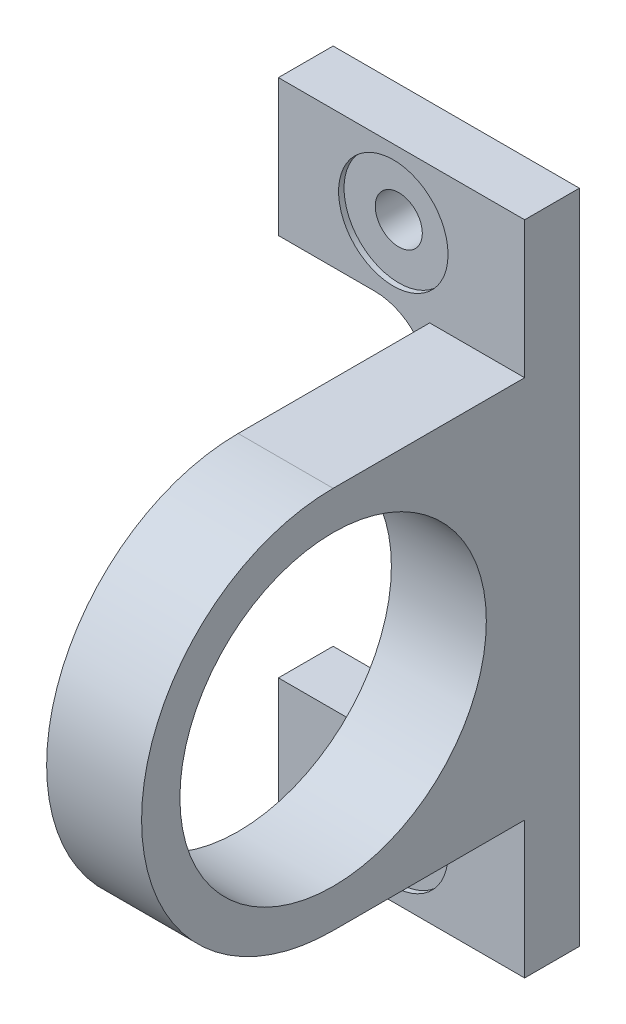
ISO-10303-21;
HEADER;
FILE_DESCRIPTION(('STEP AP214'),'2;1');
FILE_NAME('part.step','',(''),(''),'','','');
FILE_SCHEMA(('AUTOMOTIVE_DESIGN { 1 0 10303 214 1 1 1 1 }'));
ENDSEC;
DATA;
#1=APPLICATION_CONTEXT('core data for automotive mechanical design processes');
#2=APPLICATION_PROTOCOL_DEFINITION('international standard','automotive_design',2000,#1);
#3=PRODUCT_CONTEXT('',#1,'mechanical');
#4=PRODUCT('Part','Part','',(#3));
#5=PRODUCT_RELATED_PRODUCT_CATEGORY('part','',(#4));
#6=PRODUCT_DEFINITION_FORMATION('','',#4);
#7=PRODUCT_DEFINITION_CONTEXT('part definition',#1,'design');
#8=PRODUCT_DEFINITION('design','',#6,#7);
#9=PRODUCT_DEFINITION_SHAPE('','',#8);
#10=(LENGTH_UNIT() NAMED_UNIT(*) SI_UNIT(.MILLI.,.METRE.));
#11=(NAMED_UNIT(*) PLANE_ANGLE_UNIT() SI_UNIT($,.RADIAN.));
#12=(NAMED_UNIT(*) SI_UNIT($,.STERADIAN.) SOLID_ANGLE_UNIT());
#13=UNCERTAINTY_MEASURE_WITH_UNIT(LENGTH_MEASURE(1.E-05),#10,'distance_accuracy_value','');
#14=(GEOMETRIC_REPRESENTATION_CONTEXT(3) GLOBAL_UNCERTAINTY_ASSIGNED_CONTEXT((#13)) GLOBAL_UNIT_ASSIGNED_CONTEXT((#10,
#11,#12)) REPRESENTATION_CONTEXT('',''));
#15=CARTESIAN_POINT('',(0.,0.,0.));
#16=DIRECTION('',(0.,0.,1.));
#17=DIRECTION('',(1.,0.,0.));
#18=AXIS2_PLACEMENT_3D('',#15,#16,#17);
#19=CARTESIAN_POINT('',(7.72642356527553,24.3382352941177,-0.00999999999999959));
#20=DIRECTION('',(-1.,0.,0.));
#21=DIRECTION('',(0.,-1.,0.));
#22=AXIS2_PLACEMENT_3D('',#19,#20,#21);
#23=PLANE('',#22);
#24=DIRECTION('',(0.,-1.,0.));
#25=VECTOR('',#24,1.);
#26=CARTESIAN_POINT('',(7.72642356527553,0.,5.));
#27=LINE('',#26,#25);
#28=CARTESIAN_POINT('',(7.72642356527553,24.3382352941177,5.));
#29=VERTEX_POINT('',#28);
#30=CARTESIAN_POINT('',(7.72642356527553,11.8382352941177,5.));
#31=VERTEX_POINT('',#30);
#32=EDGE_CURVE('E227',#29,#31,#27,.T.);
#33=ORIENTED_EDGE('',*,*,#32,.F.);
#34=DIRECTION('',(0.,0.,-1.));
#35=VECTOR('',#34,1.);
#36=CARTESIAN_POINT('',(7.72642356527553,24.3382352941177,5.));
#37=LINE('',#36,#35);
#38=CARTESIAN_POINT('',(7.72642356527552,24.3382352941177,0.));
#39=VERTEX_POINT('',#38);
#40=EDGE_CURVE('E180',#29,#39,#37,.T.);
#41=ORIENTED_EDGE('',*,*,#40,.T.);
#42=DIRECTION('',(0.,-1.,0.));
#43=VECTOR('',#42,1.);
#44=CARTESIAN_POINT('',(7.72642356527553,0.,0.));
#45=LINE('',#44,#43);
#46=CARTESIAN_POINT('',(7.72642356527552,11.8382352941177,0.));
#47=VERTEX_POINT('',#46);
#48=EDGE_CURVE('E181',#39,#47,#45,.T.);
#49=ORIENTED_EDGE('',*,*,#48,.T.);
#50=DIRECTION('',(0.,0.,1.));
#51=VECTOR('',#50,1.);
#52=CARTESIAN_POINT('',(7.72642356527553,11.8382352941177,5.));
#53=LINE('',#52,#51);
#54=EDGE_CURVE('E230',#47,#31,#53,.T.);
#55=ORIENTED_EDGE('',*,*,#54,.T.);
#56=EDGE_LOOP('',(#33,#41,#49,#55));
#57=FACE_BOUND('',#56,.T.);
#58=ADVANCED_FACE('F54',(#57),#23,.T.);
#59=DIRECTION('',(0.,-1.,0.));
#60=VECTOR('',#59,1.);
#61=CARTESIAN_POINT('',(7.72642356527553,0.,5.));
#62=LINE('',#61,#60);
#63=CARTESIAN_POINT('',(7.72642356527552,-23.1617647058823,5.));
#64=VERTEX_POINT('',#63);
#65=CARTESIAN_POINT('',(7.72642356527552,-35.6617647058823,5.));
#66=VERTEX_POINT('',#65);
#67=EDGE_CURVE('E224',#64,#66,#62,.T.);
#68=ORIENTED_EDGE('',*,*,#67,.F.);
#69=DIRECTION('',(0.,0.,-1.));
#70=VECTOR('',#69,1.);
#71=CARTESIAN_POINT('',(7.72642356527552,-23.1617647058823,5.));
#72=LINE('',#71,#70);
#73=CARTESIAN_POINT('',(7.72642356527552,-23.1617647058823,0.));
#74=VERTEX_POINT('',#73);
#75=EDGE_CURVE('E186',#64,#74,#72,.T.);
#76=ORIENTED_EDGE('',*,*,#75,.T.);
#77=CARTESIAN_POINT('',(7.72642356527552,-35.6617647058823,0.));
#78=VERTEX_POINT('',#77);
#79=EDGE_CURVE('E163',#74,#78,#45,.T.);
#80=ORIENTED_EDGE('',*,*,#79,.T.);
#81=DIRECTION('',(0.,0.,1.));
#82=VECTOR('',#81,1.);
#83=CARTESIAN_POINT('',(7.72642356527552,-35.6617647058823,5.));
#84=LINE('',#83,#82);
#85=EDGE_CURVE('E174',#78,#66,#84,.T.);
#86=ORIENTED_EDGE('',*,*,#85,.T.);
#87=EDGE_LOOP('',(#68,#76,#80,#86));
#88=FACE_BOUND('',#87,.T.);
#89=ADVANCED_FACE('F184',(#88),#23,.T.);
#90=CARTESIAN_POINT('',(0.,0.,5.));
#91=DIRECTION('',(0.,0.,1.));
#92=DIRECTION('',(1.,0.,0.));
#93=AXIS2_PLACEMENT_3D('',#90,#91,#92);
#94=PLANE('',#93);
#95=CARTESIAN_POINT('',(18.2264235652755,18.0882352941177,5.));
#96=DIRECTION('',(0.,0.,1.));
#97=DIRECTION('',(1.,0.,0.));
#98=AXIS2_PLACEMENT_3D('',#95,#96,#97);
#99=CIRCLE('',#98,4.99999999999999);
#100=CARTESIAN_POINT('',(23.2264235652755,18.0882352941177,5.));
#101=VERTEX_POINT('',#100);
#102=EDGE_CURVE('E458',#101,#101,#99,.T.);
#103=ORIENTED_EDGE('',*,*,#102,.F.);
#104=EDGE_LOOP('',(#103));
#105=FACE_BOUND('',#104,.T.);
#106=DIRECTION('',(-1.,0.,0.));
#107=VECTOR('',#106,1.);
#108=CARTESIAN_POINT('',(0.,24.3382352941177,5.));
#109=LINE('',#108,#107);
#110=CARTESIAN_POINT('',(30.2264235652755,24.3382352941177,5.));
#111=VERTEX_POINT('',#110);
#112=EDGE_CURVE('E201',#111,#29,#109,.T.);
#113=ORIENTED_EDGE('',*,*,#112,.T.);
#114=ORIENTED_EDGE('',*,*,#32,.T.);
#115=DIRECTION('',(1.,0.,0.));
#116=VECTOR('',#115,1.);
#117=CARTESIAN_POINT('',(0.,11.8382352941177,5.));
#118=LINE('',#117,#116);
#119=CARTESIAN_POINT('',(16.5499529770402,11.8382352941177,5.));
#120=VERTEX_POINT('',#119);
#121=EDGE_CURVE('E197',#31,#120,#118,.T.);
#122=ORIENTED_EDGE('',*,*,#121,.T.);
#123=CARTESIAN_POINT('',(16.5499529770402,6.83823529411772,5.));
#124=DIRECTION('',(0.,0.,1.));
#125=DIRECTION('',(1.,0.,0.));
#126=AXIS2_PLACEMENT_3D('',#123,#124,#125);
#127=CIRCLE('',#126,5.);
#128=CARTESIAN_POINT('',(21.5499529770402,6.83823529411772,5.));
#129=VERTEX_POINT('',#128);
#130=EDGE_CURVE('E287',#120,#129,#127,.F.);
#131=ORIENTED_EDGE('',*,*,#130,.T.);
#132=DIRECTION('',(0.,-1.,0.));
#133=VECTOR('',#132,1.);
#134=CARTESIAN_POINT('',(21.5499529770402,0.,5.));
#135=LINE('',#134,#133);
#136=CARTESIAN_POINT('',(21.5499529770402,11.8382352941177,5.));
#137=VERTEX_POINT('',#136);
#138=EDGE_CURVE('E286',#137,#129,#135,.T.);
#139=ORIENTED_EDGE('',*,*,#138,.F.);
#140=DIRECTION('',(-1.,0.,0.));
#141=VECTOR('',#140,1.);
#142=CARTESIAN_POINT('',(30.2264235652755,11.8382352941177,5.));
#143=LINE('',#142,#141);
#144=CARTESIAN_POINT('',(30.2264235652755,11.8382352941177,5.));
#145=VERTEX_POINT('',#144);
#146=EDGE_CURVE('E215',#145,#137,#143,.T.);
#147=ORIENTED_EDGE('',*,*,#146,.F.);
#148=DIRECTION('',(0.,-1.,0.));
#149=VECTOR('',#148,1.);
#150=CARTESIAN_POINT('',(30.2264235652755,0.,5.));
#151=LINE('',#150,#149);
#152=EDGE_CURVE('E203',#111,#145,#151,.T.);
#153=ORIENTED_EDGE('',*,*,#152,.F.);
#154=EDGE_LOOP('',(#113,#114,#122,#131,#139,#147,#153));
#155=FACE_BOUND('',#154,.T.);
#156=ADVANCED_FACE('F250',(#105,#155),#94,.T.);
#157=CARTESIAN_POINT('',(18.2264235652755,-29.4117647058823,5.));
#158=DIRECTION('',(0.,0.,1.));
#159=DIRECTION('',(1.,0.,0.));
#160=AXIS2_PLACEMENT_3D('',#157,#158,#159);
#161=CIRCLE('',#160,4.99999999999999);
#162=CARTESIAN_POINT('',(23.2264235652755,-29.4117647058823,5.));
#163=VERTEX_POINT('',#162);
#164=EDGE_CURVE('E446',#163,#163,#161,.T.);
#165=ORIENTED_EDGE('',*,*,#164,.F.);
#166=EDGE_LOOP('',(#165));
#167=FACE_BOUND('',#166,.T.);
#168=DIRECTION('',(-1.,0.,0.));
#169=VECTOR('',#168,1.);
#170=CARTESIAN_POINT('',(0.,-23.1617647058823,5.));
#171=LINE('',#170,#169);
#172=CARTESIAN_POINT('',(16.5499529770402,-23.1617647058823,5.));
#173=VERTEX_POINT('',#172);
#174=EDGE_CURVE('E195',#173,#64,#171,.T.);
#175=ORIENTED_EDGE('',*,*,#174,.T.);
#176=ORIENTED_EDGE('',*,*,#67,.T.);
#177=DIRECTION('',(1.,0.,0.));
#178=VECTOR('',#177,1.);
#179=CARTESIAN_POINT('',(0.,-35.6617647058823,5.));
#180=LINE('',#179,#178);
#181=CARTESIAN_POINT('',(30.2264235652755,-35.6617647058823,5.));
#182=VERTEX_POINT('',#181);
#183=EDGE_CURVE('E176',#66,#182,#180,.T.);
#184=ORIENTED_EDGE('',*,*,#183,.T.);
#185=CARTESIAN_POINT('',(30.2264235652755,-23.1617647058823,5.));
#186=VERTEX_POINT('',#185);
#187=EDGE_CURVE('E207',#186,#182,#151,.T.);
#188=ORIENTED_EDGE('',*,*,#187,.F.);
#189=DIRECTION('',(1.,0.,0.));
#190=VECTOR('',#189,1.);
#191=CARTESIAN_POINT('',(30.2264235652755,-23.1617647058823,5.));
#192=LINE('',#191,#190);
#193=CARTESIAN_POINT('',(21.5499529770402,-23.1617647058823,5.));
#194=VERTEX_POINT('',#193);
#195=EDGE_CURVE('E218',#194,#186,#192,.T.);
#196=ORIENTED_EDGE('',*,*,#195,.F.);
#197=DIRECTION('',(0.,-1.,0.));
#198=VECTOR('',#197,1.);
#199=CARTESIAN_POINT('',(21.5499529770402,0.,5.));
#200=LINE('',#199,#198);
#201=CARTESIAN_POINT('',(21.5499529770402,-18.1617647058823,5.));
#202=VERTEX_POINT('',#201);
#203=EDGE_CURVE('E259',#202,#194,#200,.T.);
#204=ORIENTED_EDGE('',*,*,#203,.F.);
#205=CARTESIAN_POINT('',(16.5499529770402,-18.1617647058823,5.));
#206=DIRECTION('',(0.,0.,1.));
#207=DIRECTION('',(1.,0.,0.));
#208=AXIS2_PLACEMENT_3D('',#205,#206,#207);
#209=CIRCLE('',#208,5.);
#210=EDGE_CURVE('E226',#202,#173,#209,.F.);
#211=ORIENTED_EDGE('',*,*,#210,.T.);
#212=EDGE_LOOP('',(#175,#176,#184,#188,#196,#204,#211));
#213=FACE_BOUND('',#212,.T.);
#214=ADVANCED_FACE('F279',(#167,#213),#94,.T.);
#215=CARTESIAN_POINT('',(0.,11.8382352941177,5.));
#216=DIRECTION('',(0.,1.,0.));
#217=DIRECTION('',(-1.,0.,0.));
#218=AXIS2_PLACEMENT_3D('',#215,#216,#217);
#219=PLANE('',#218);
#220=ORIENTED_EDGE('',*,*,#54,.F.);
#221=DIRECTION('',(1.,0.,0.));
#222=VECTOR('',#221,1.);
#223=CARTESIAN_POINT('',(0.,11.8382352941177,0.));
#224=LINE('',#223,#222);
#225=CARTESIAN_POINT('',(16.5499529770402,11.8382352941177,0.));
#226=VERTEX_POINT('',#225);
#227=EDGE_CURVE('E171',#47,#226,#224,.T.);
#228=ORIENTED_EDGE('',*,*,#227,.T.);
#229=DIRECTION('',(0.,0.,-1.));
#230=VECTOR('',#229,1.);
#231=CARTESIAN_POINT('',(16.5499529770402,11.8382352941177,5.));
#232=LINE('',#231,#230);
#233=EDGE_CURVE('E247',#226,#120,#232,.F.);
#234=ORIENTED_EDGE('',*,*,#233,.T.);
#235=ORIENTED_EDGE('',*,*,#121,.F.);
#236=EDGE_LOOP('',(#220,#228,#234,#235));
#237=FACE_BOUND('',#236,.T.);
#238=ADVANCED_FACE('F246',(#237),#219,.F.);
#239=CARTESIAN_POINT('',(0.,-23.1617647058823,5.));
#240=DIRECTION('',(0.,-1.,0.));
#241=DIRECTION('',(1.,0.,0.));
#242=AXIS2_PLACEMENT_3D('',#239,#240,#241);
#243=PLANE('',#242);
#244=ORIENTED_EDGE('',*,*,#75,.F.);
#245=ORIENTED_EDGE('',*,*,#174,.F.);
#246=DIRECTION('',(0.,0.,-1.));
#247=VECTOR('',#246,1.);
#248=CARTESIAN_POINT('',(16.5499529770402,-23.1617647058823,5.));
#249=LINE('',#248,#247);
#250=CARTESIAN_POINT('',(16.5499529770402,-23.1617647058823,0.));
#251=VERTEX_POINT('',#250);
#252=EDGE_CURVE('E426',#173,#251,#249,.T.);
#253=ORIENTED_EDGE('',*,*,#252,.T.);
#254=DIRECTION('',(-1.,0.,0.));
#255=VECTOR('',#254,1.);
#256=CARTESIAN_POINT('',(0.,-23.1617647058823,0.));
#257=LINE('',#256,#255);
#258=EDGE_CURVE('E204',#251,#74,#257,.T.);
#259=ORIENTED_EDGE('',*,*,#258,.T.);
#260=EDGE_LOOP('',(#244,#245,#253,#259));
#261=FACE_BOUND('',#260,.T.);
#262=ADVANCED_FACE('F323',(#261),#243,.F.);
#263=CARTESIAN_POINT('',(0.,24.3382352941177,5.));
#264=DIRECTION('',(0.,-1.,0.));
#265=DIRECTION('',(0.,0.,-1.));
#266=AXIS2_PLACEMENT_3D('',#263,#264,#265);
#267=PLANE('',#266);
#268=ORIENTED_EDGE('',*,*,#40,.F.);
#269=ORIENTED_EDGE('',*,*,#112,.F.);
#270=DIRECTION('',(0.,0.,-1.));
#271=VECTOR('',#270,1.);
#272=CARTESIAN_POINT('',(30.2264235652755,24.3382352941177,5.));
#273=LINE('',#272,#271);
#274=CARTESIAN_POINT('',(30.2264235652755,24.3382352941177,0.));
#275=VERTEX_POINT('',#274);
#276=EDGE_CURVE('E255',#111,#275,#273,.T.);
#277=ORIENTED_EDGE('',*,*,#276,.T.);
#278=DIRECTION('',(-1.,0.,0.));
#279=VECTOR('',#278,1.);
#280=CARTESIAN_POINT('',(0.,24.3382352941177,0.));
#281=LINE('',#280,#279);
#282=EDGE_CURVE('E170',#275,#39,#281,.T.);
#283=ORIENTED_EDGE('',*,*,#282,.T.);
#284=EDGE_LOOP('',(#268,#269,#277,#283));
#285=FACE_BOUND('',#284,.T.);
#286=ADVANCED_FACE('F254',(#285),#267,.F.);
#287=CARTESIAN_POINT('',(0.,-35.6617647058823,5.));
#288=DIRECTION('',(0.,1.,0.));
#289=DIRECTION('',(0.,0.,1.));
#290=AXIS2_PLACEMENT_3D('',#287,#288,#289);
#291=PLANE('',#290);
#292=ORIENTED_EDGE('',*,*,#85,.F.);
#293=DIRECTION('',(1.,0.,0.));
#294=VECTOR('',#293,1.);
#295=CARTESIAN_POINT('',(0.,-35.6617647058823,0.));
#296=LINE('',#295,#294);
#297=CARTESIAN_POINT('',(30.2264235652755,-35.6617647058823,0.));
#298=VERTEX_POINT('',#297);
#299=EDGE_CURVE('E158',#78,#298,#296,.T.);
#300=ORIENTED_EDGE('',*,*,#299,.T.);
#301=DIRECTION('',(0.,0.,-1.));
#302=VECTOR('',#301,1.);
#303=CARTESIAN_POINT('',(30.2264235652755,-35.6617647058823,5.));
#304=LINE('',#303,#302);
#305=EDGE_CURVE('E198',#182,#298,#304,.T.);
#306=ORIENTED_EDGE('',*,*,#305,.F.);
#307=ORIENTED_EDGE('',*,*,#183,.F.);
#308=EDGE_LOOP('',(#292,#300,#306,#307));
#309=FACE_BOUND('',#308,.T.);
#310=ADVANCED_FACE('F175',(#309),#291,.F.);
#311=CARTESIAN_POINT('',(0.,0.,0.));
#312=DIRECTION('',(0.,0.,1.));
#313=DIRECTION('',(1.,0.,0.));
#314=AXIS2_PLACEMENT_3D('',#311,#312,#313);
#315=PLANE('',#314);
#316=CARTESIAN_POINT('',(18.2264235652755,18.0882352941177,0.));
#317=DIRECTION('',(0.,0.,1.));
#318=DIRECTION('',(1.,0.,0.));
#319=AXIS2_PLACEMENT_3D('',#316,#317,#318);
#320=CIRCLE('',#319,2.15);
#321=CARTESIAN_POINT('',(20.3764235652755,18.0882352941177,0.));
#322=VERTEX_POINT('',#321);
#323=EDGE_CURVE('E449',#322,#322,#320,.T.);
#324=ORIENTED_EDGE('',*,*,#323,.T.);
#325=EDGE_LOOP('',(#324));
#326=FACE_BOUND('',#325,.T.);
#327=CARTESIAN_POINT('',(18.2264235652755,-29.4117647058823,0.));
#328=DIRECTION('',(0.,0.,1.));
#329=DIRECTION('',(1.,0.,0.));
#330=AXIS2_PLACEMENT_3D('',#327,#328,#329);
#331=CIRCLE('',#330,2.15);
#332=CARTESIAN_POINT('',(20.3764235652755,-29.4117647058823,0.));
#333=VERTEX_POINT('',#332);
#334=EDGE_CURVE('E187',#333,#333,#331,.T.);
#335=ORIENTED_EDGE('',*,*,#334,.T.);
#336=EDGE_LOOP('',(#335));
#337=FACE_BOUND('',#336,.T.);
#338=ORIENTED_EDGE('',*,*,#48,.F.);
#339=ORIENTED_EDGE('',*,*,#282,.F.);
#340=DIRECTION('',(0.,-1.,0.));
#341=VECTOR('',#340,1.);
#342=CARTESIAN_POINT('',(30.2264235652755,0.,0.));
#343=LINE('',#342,#341);
#344=EDGE_CURVE('E166',#275,#298,#343,.T.);
#345=ORIENTED_EDGE('',*,*,#344,.T.);
#346=ORIENTED_EDGE('',*,*,#299,.F.);
#347=ORIENTED_EDGE('',*,*,#79,.F.);
#348=ORIENTED_EDGE('',*,*,#258,.F.);
#349=CARTESIAN_POINT('',(16.5499529770402,-18.1617647058823,0.));
#350=DIRECTION('',(0.,0.,1.));
#351=DIRECTION('',(1.,0.,0.));
#352=AXIS2_PLACEMENT_3D('',#349,#350,#351);
#353=CIRCLE('',#352,5.);
#354=CARTESIAN_POINT('',(21.5499529770402,-18.1617647058823,0.));
#355=VERTEX_POINT('',#354);
#356=EDGE_CURVE('E424',#251,#355,#353,.T.);
#357=ORIENTED_EDGE('',*,*,#356,.T.);
#358=DIRECTION('',(0.,1.,0.));
#359=VECTOR('',#358,1.);
#360=CARTESIAN_POINT('',(21.5499529770402,0.,0.));
#361=LINE('',#360,#359);
#362=CARTESIAN_POINT('',(21.5499529770402,6.83823529411772,0.));
#363=VERTEX_POINT('',#362);
#364=EDGE_CURVE('E206',#355,#363,#361,.T.);
#365=ORIENTED_EDGE('',*,*,#364,.T.);
#366=CARTESIAN_POINT('',(16.5499529770402,6.83823529411772,0.));
#367=DIRECTION('',(0.,0.,1.));
#368=DIRECTION('',(1.,0.,0.));
#369=AXIS2_PLACEMENT_3D('',#366,#367,#368);
#370=CIRCLE('',#369,5.);
#371=EDGE_CURVE('E242',#363,#226,#370,.T.);
#372=ORIENTED_EDGE('',*,*,#371,.T.);
#373=ORIENTED_EDGE('',*,*,#227,.F.);
#374=EDGE_LOOP('',(#338,#339,#345,#346,#347,#348,#357,#365,#372,#373));
#375=FACE_BOUND('',#374,.T.);
#376=ADVANCED_FACE('F56',(#326,#337,#375),#315,.F.);
#377=CARTESIAN_POINT('',(21.5499529770402,0.,5.));
#378=DIRECTION('',(-1.,0.,0.));
#379=DIRECTION('',(0.,0.,1.));
#380=AXIS2_PLACEMENT_3D('',#377,#378,#379);
#381=PLANE('',#380);
#382=CARTESIAN_POINT('',(21.5499529770402,-5.66176470588227,22.5));
#383=DIRECTION('',(-1.,0.,0.));
#384=DIRECTION('',(0.,0.,1.));
#385=AXIS2_PLACEMENT_3D('',#382,#383,#384);
#386=CIRCLE('',#385,14.);
#387=CARTESIAN_POINT('',(21.5499529770402,-5.66176470588227,36.5));
#388=VERTEX_POINT('',#387);
#389=EDGE_CURVE('E63',#388,#388,#386,.T.);
#390=ORIENTED_EDGE('',*,*,#389,.F.);
#391=EDGE_LOOP('',(#390));
#392=FACE_BOUND('',#391,.T.);
#393=ORIENTED_EDGE('',*,*,#138,.T.);
#394=DIRECTION('',(0.,0.,-1.));
#395=VECTOR('',#394,1.);
#396=CARTESIAN_POINT('',(21.5499529770402,6.83823529411772,5.));
#397=LINE('',#396,#395);
#398=EDGE_CURVE('E291',#129,#363,#397,.T.);
#399=ORIENTED_EDGE('',*,*,#398,.T.);
#400=ORIENTED_EDGE('',*,*,#364,.F.);
#401=DIRECTION('',(0.,0.,-1.));
#402=VECTOR('',#401,1.);
#403=CARTESIAN_POINT('',(21.5499529770402,-18.1617647058823,5.));
#404=LINE('',#403,#402);
#405=EDGE_CURVE('E290',#355,#202,#404,.F.);
#406=ORIENTED_EDGE('',*,*,#405,.T.);
#407=ORIENTED_EDGE('',*,*,#203,.T.);
#408=DIRECTION('',(0.,0.,-1.));
#409=VECTOR('',#408,1.);
#410=CARTESIAN_POINT('',(21.5499529770402,-23.1617647058823,40.));
#411=LINE('',#410,#409);
#412=CARTESIAN_POINT('',(21.5499529770402,-23.1617647058823,22.5));
#413=VERTEX_POINT('',#412);
#414=EDGE_CURVE('E270',#413,#194,#411,.T.);
#415=ORIENTED_EDGE('',*,*,#414,.F.);
#416=CARTESIAN_POINT('',(21.5499529770402,-5.66176470588227,22.5));
#417=DIRECTION('',(-1.,0.,0.));
#418=DIRECTION('',(0.,0.,1.));
#419=AXIS2_PLACEMENT_3D('',#416,#417,#418);
#420=CIRCLE('',#419,17.5);
#421=CARTESIAN_POINT('',(21.5499529770402,11.8382352941177,22.5));
#422=VERTEX_POINT('',#421);
#423=EDGE_CURVE('E79',#413,#422,#420,.T.);
#424=ORIENTED_EDGE('',*,*,#423,.T.);
#425=DIRECTION('',(0.,0.,-1.));
#426=VECTOR('',#425,1.);
#427=CARTESIAN_POINT('',(21.5499529770402,11.8382352941177,40.));
#428=LINE('',#427,#426);
#429=EDGE_CURVE('E268',#422,#137,#428,.T.);
#430=ORIENTED_EDGE('',*,*,#429,.T.);
#431=EDGE_LOOP('',(#393,#399,#400,#406,#407,#415,#424,#430));
#432=FACE_BOUND('',#431,.T.);
#433=ADVANCED_FACE('F293',(#392,#432),#381,.T.);
#434=CARTESIAN_POINT('',(30.2264235652755,0.,5.));
#435=DIRECTION('',(1.,0.,0.));
#436=DIRECTION('',(0.,0.,-1.));
#437=AXIS2_PLACEMENT_3D('',#434,#435,#436);
#438=PLANE('',#437);
#439=CARTESIAN_POINT('',(30.2264235652755,-5.66176470588227,22.5));
#440=DIRECTION('',(-1.,0.,0.));
#441=DIRECTION('',(0.,0.,1.));
#442=AXIS2_PLACEMENT_3D('',#439,#440,#441);
#443=CIRCLE('',#442,14.);
#444=CARTESIAN_POINT('',(30.2264235652755,-5.66176470588227,36.5));
#445=VERTEX_POINT('',#444);
#446=EDGE_CURVE('E12',#445,#445,#443,.T.);
#447=ORIENTED_EDGE('',*,*,#446,.T.);
#448=EDGE_LOOP('',(#447));
#449=FACE_BOUND('',#448,.T.);
#450=DIRECTION('',(0.,0.,-1.));
#451=VECTOR('',#450,1.);
#452=CARTESIAN_POINT('',(30.2264235652755,11.8382352941177,40.));
#453=LINE('',#452,#451);
#454=CARTESIAN_POINT('',(30.2264235652755,11.8382352941177,22.5));
#455=VERTEX_POINT('',#454);
#456=EDGE_CURVE('E265',#455,#145,#453,.T.);
#457=ORIENTED_EDGE('',*,*,#456,.F.);
#458=CARTESIAN_POINT('',(30.2264235652755,-5.66176470588227,22.5));
#459=DIRECTION('',(-1.,0.,0.));
#460=DIRECTION('',(0.,0.,1.));
#461=AXIS2_PLACEMENT_3D('',#458,#459,#460);
#462=CIRCLE('',#461,17.5);
#463=CARTESIAN_POINT('',(30.2264235652755,-23.1617647058823,22.5));
#464=VERTEX_POINT('',#463);
#465=EDGE_CURVE('E71',#464,#455,#462,.T.);
#466=ORIENTED_EDGE('',*,*,#465,.F.);
#467=DIRECTION('',(0.,0.,-1.));
#468=VECTOR('',#467,1.);
#469=CARTESIAN_POINT('',(30.2264235652755,-23.1617647058823,40.));
#470=LINE('',#469,#468);
#471=EDGE_CURVE('E272',#464,#186,#470,.T.);
#472=ORIENTED_EDGE('',*,*,#471,.T.);
#473=ORIENTED_EDGE('',*,*,#187,.T.);
#474=ORIENTED_EDGE('',*,*,#305,.T.);
#475=ORIENTED_EDGE('',*,*,#344,.F.);
#476=ORIENTED_EDGE('',*,*,#276,.F.);
#477=ORIENTED_EDGE('',*,*,#152,.T.);
#478=EDGE_LOOP('',(#457,#466,#472,#473,#474,#475,#476,#477));
#479=FACE_BOUND('',#478,.T.);
#480=ADVANCED_FACE('F281',(#449,#479),#438,.T.);
#481=CARTESIAN_POINT('',(30.2264235652755,11.8382352941177,40.));
#482=DIRECTION('',(0.,-1.,0.));
#483=DIRECTION('',(0.,0.,-1.));
#484=AXIS2_PLACEMENT_3D('',#481,#482,#483);
#485=PLANE('',#484);
#486=DIRECTION('',(-1.,0.,0.));
#487=VECTOR('',#486,1.);
#488=CARTESIAN_POINT('',(30.2264235652755,11.8382352941177,22.5));
#489=LINE('',#488,#487);
#490=EDGE_CURVE('E58',#455,#422,#489,.T.);
#491=ORIENTED_EDGE('',*,*,#490,.F.);
#492=ORIENTED_EDGE('',*,*,#456,.T.);
#493=ORIENTED_EDGE('',*,*,#146,.T.);
#494=ORIENTED_EDGE('',*,*,#429,.F.);
#495=EDGE_LOOP('',(#491,#492,#493,#494));
#496=FACE_BOUND('',#495,.T.);
#497=ADVANCED_FACE('F283',(#496),#485,.F.);
#498=CARTESIAN_POINT('',(30.2264235652755,-23.1617647058823,40.));
#499=DIRECTION('',(0.,1.,0.));
#500=DIRECTION('',(0.,0.,1.));
#501=AXIS2_PLACEMENT_3D('',#498,#499,#500);
#502=PLANE('',#501);
#503=ORIENTED_EDGE('',*,*,#471,.F.);
#504=DIRECTION('',(-1.,0.,0.));
#505=VECTOR('',#504,1.);
#506=CARTESIAN_POINT('',(30.2264235652755,-23.1617647058823,22.5));
#507=LINE('',#506,#505);
#508=EDGE_CURVE('E209',#464,#413,#507,.T.);
#509=ORIENTED_EDGE('',*,*,#508,.T.);
#510=ORIENTED_EDGE('',*,*,#414,.T.);
#511=ORIENTED_EDGE('',*,*,#195,.T.);
#512=EDGE_LOOP('',(#503,#509,#510,#511));
#513=FACE_BOUND('',#512,.T.);
#514=ADVANCED_FACE('F276',(#513),#502,.F.);
#515=CARTESIAN_POINT('',(30.2264235652755,-5.66176470588227,22.5));
#516=DIRECTION('',(-1.,0.,0.));
#517=DIRECTION('',(0.,0.,1.));
#518=AXIS2_PLACEMENT_3D('',#515,#516,#517);
#519=CYLINDRICAL_SURFACE('',#518,17.5);
#520=ORIENTED_EDGE('',*,*,#508,.F.);
#521=ORIENTED_EDGE('',*,*,#465,.T.);
#522=ORIENTED_EDGE('',*,*,#490,.T.);
#523=ORIENTED_EDGE('',*,*,#423,.F.);
#524=EDGE_LOOP('',(#520,#521,#522,#523));
#525=FACE_BOUND('',#524,.T.);
#526=ADVANCED_FACE('F319',(#525),#519,.T.);
#527=CARTESIAN_POINT('',(30.2264235652755,-5.66176470588227,22.5));
#528=DIRECTION('',(-1.,0.,0.));
#529=DIRECTION('',(0.,0.,1.));
#530=AXIS2_PLACEMENT_3D('',#527,#528,#529);
#531=CYLINDRICAL_SURFACE('',#530,14.);
#532=CARTESIAN_POINT('',(21.5499529770402,-5.66176470588227,36.5));
#533=CARTESIAN_POINT('',(21.640332879001,-5.66176470588227,36.5));
#534=CARTESIAN_POINT('',(21.7307127809618,-5.66176470588227,36.5));
#535=CARTESIAN_POINT('',(21.9114725848834,-5.66176470588227,36.5));
#536=CARTESIAN_POINT('',(22.0018524868441,-5.66176470588227,36.5));
#537=CARTESIAN_POINT('',(22.1826122907657,-5.66176470588227,36.5));
#538=CARTESIAN_POINT('',(22.2729921927265,-5.66176470588227,36.5));
#539=CARTESIAN_POINT('',(22.4537519966481,-5.66176470588227,36.5));
#540=CARTESIAN_POINT('',(22.5441318986088,-5.66176470588227,36.5));
#541=CARTESIAN_POINT('',(22.7248917025304,-5.66176470588227,36.5));
#542=CARTESIAN_POINT('',(22.8152716044912,-5.66176470588227,36.5));
#543=CARTESIAN_POINT('',(22.9960314084128,-5.66176470588227,36.5));
#544=CARTESIAN_POINT('',(23.0864113103735,-5.66176470588227,36.5));
#545=CARTESIAN_POINT('',(23.2671711142951,-5.66176470588227,36.5));
#546=CARTESIAN_POINT('',(23.3575510162559,-5.66176470588227,36.5));
#547=CARTESIAN_POINT('',(23.5383108201775,-5.66176470588227,36.5));
#548=CARTESIAN_POINT('',(23.6286907221383,-5.66176470588227,36.5));
#549=CARTESIAN_POINT('',(23.8094505260598,-5.66176470588227,36.5));
#550=CARTESIAN_POINT('',(23.8998304280206,-5.66176470588227,36.5));
#551=CARTESIAN_POINT('',(24.0805902319422,-5.66176470588227,36.5));
#552=CARTESIAN_POINT('',(24.170970133903,-5.66176470588227,36.5));
#553=CARTESIAN_POINT('',(24.3517299378245,-5.66176470588227,36.5));
#554=CARTESIAN_POINT('',(24.4421098397853,-5.66176470588227,36.5));
#555=CARTESIAN_POINT('',(24.6228696437069,-5.66176470588227,36.5));
#556=CARTESIAN_POINT('',(24.7132495456677,-5.66176470588227,36.5));
#557=CARTESIAN_POINT('',(24.8940093495892,-5.66176470588227,36.5));
#558=CARTESIAN_POINT('',(24.98438925155,-5.66176470588227,36.5));
#559=CARTESIAN_POINT('',(25.1651490554716,-5.66176470588227,36.5));
#560=CARTESIAN_POINT('',(25.2555289574324,-5.66176470588227,36.5));
#561=CARTESIAN_POINT('',(25.4362887613539,-5.66176470588227,36.5));
#562=CARTESIAN_POINT('',(25.5266686633147,-5.66176470588227,36.5));
#563=CARTESIAN_POINT('',(25.7074284672363,-5.66176470588227,36.5));
#564=CARTESIAN_POINT('',(25.7978083691971,-5.66176470588227,36.5));
#565=CARTESIAN_POINT('',(25.9785681731187,-5.66176470588227,36.5));
#566=CARTESIAN_POINT('',(26.0689480750794,-5.66176470588227,36.5));
#567=CARTESIAN_POINT('',(26.249707879001,-5.66176470588227,36.5));
#568=CARTESIAN_POINT('',(26.3400877809618,-5.66176470588227,36.5));
#569=CARTESIAN_POINT('',(26.5208475848834,-5.66176470588227,36.5));
#570=CARTESIAN_POINT('',(26.6112274868441,-5.66176470588227,36.5));
#571=CARTESIAN_POINT('',(26.7919872907657,-5.66176470588227,36.5));
#572=CARTESIAN_POINT('',(26.8823671927265,-5.66176470588227,36.5));
#573=CARTESIAN_POINT('',(27.0631269966481,-5.66176470588227,36.5));
#574=CARTESIAN_POINT('',(27.1535068986088,-5.66176470588227,36.5));
#575=CARTESIAN_POINT('',(27.3342667025304,-5.66176470588227,36.5));
#576=CARTESIAN_POINT('',(27.4246466044912,-5.66176470588227,36.5));
#577=CARTESIAN_POINT('',(27.6054064084128,-5.66176470588227,36.5));
#578=CARTESIAN_POINT('',(27.6957863103736,-5.66176470588227,36.5));
#579=CARTESIAN_POINT('',(27.8765461142951,-5.66176470588227,36.5));
#580=CARTESIAN_POINT('',(27.9669260162559,-5.66176470588227,36.5));
#581=CARTESIAN_POINT('',(28.1476858201775,-5.66176470588227,36.5));
#582=CARTESIAN_POINT('',(28.2380657221383,-5.66176470588227,36.5));
#583=CARTESIAN_POINT('',(28.4188255260598,-5.66176470588227,36.5));
#584=CARTESIAN_POINT('',(28.5092054280206,-5.66176470588227,36.5));
#585=CARTESIAN_POINT('',(28.6899652319422,-5.66176470588227,36.5));
#586=CARTESIAN_POINT('',(28.780345133903,-5.66176470588227,36.5));
#587=CARTESIAN_POINT('',(28.9611049378245,-5.66176470588227,36.5));
#588=CARTESIAN_POINT('',(29.0514848397853,-5.66176470588227,36.5));
#589=CARTESIAN_POINT('',(29.2322446437069,-5.66176470588227,36.5));
#590=CARTESIAN_POINT('',(29.3226245456677,-5.66176470588227,36.5));
#591=CARTESIAN_POINT('',(29.5033843495893,-5.66176470588227,36.5));
#592=CARTESIAN_POINT('',(29.59376425155,-5.66176470588227,36.5));
#593=CARTESIAN_POINT('',(29.7745240554716,-5.66176470588227,36.5));
#594=CARTESIAN_POINT('',(29.8649039574324,-5.66176470588227,36.5));
#595=CARTESIAN_POINT('',(30.045663761354,-5.66176470588227,36.5));
#596=CARTESIAN_POINT('',(30.1360436633147,-5.66176470588227,36.5));
#597=CARTESIAN_POINT('',(30.2264235652755,-5.66176470588227,36.5));
#598=B_SPLINE_CURVE_WITH_KNOTS('',3,(#532,#533,#534,#535,#536,#537,#538,#539,#540,#541,#542,
#543,#544,#545,#546,#547,#548,#549,#550,#551,#552,#553,#554,#555,#556,#557,#558,#559,#560,#561,
#562,#563,#564,#565,#566,#567,#568,#569,#570,#571,#572,#573,#574,#575,#576,#577,#578,#579,#580,
#581,#582,#583,#584,#585,#586,#587,#588,#589,#590,#591,#592,#593,#594,#595,#596,#597),
.UNSPECIFIED.,.F.,.F.,(4,2,2,2,2,2,2,2,2,2,2,2,2,2,2,2,2,2,2,2,2,2,2,2,2,2,2,2,2,2,2,2,4),(0.,
0.271139705882356,0.542279411764709,0.813419117647062,1.08455882352941,1.35569852941177,
1.62683823529412,1.89797794117648,2.16911764705883,2.44025735294118,2.71139705882354,
2.98253676470589,3.25367647058825,3.5248161764706,3.79595588235295,4.0670955882353,
4.33823529411766,4.60937500000001,4.88051470588237,5.15165441176472,5.42279411764707,
5.69393382352943,5.96507352941178,6.23621323529413,6.50735294117649,6.77849264705884,
7.04963235294119,7.32077205882355,7.5919117647059,7.86305147058826,8.13419117647061,
8.40533088235296,8.67647058823531),.UNSPECIFIED.);
#599=EDGE_CURVE('BSEAM418',#388,#445,#598,.T.);
#600=ORIENTED_EDGE('',*,*,#389,.T.);
#601=ORIENTED_EDGE('',*,*,#446,.F.);
#602=ORIENTED_EDGE('',*,*,#599,.T.);
#603=ORIENTED_EDGE('',*,*,#599,.F.);
#604=EDGE_LOOP('',(#600,#602,#601,#603));
#605=FACE_BOUND('',#604,.T.);
#606=ADVANCED_FACE('F418',(#605),#531,.F.);
#607=CARTESIAN_POINT('',(16.5499529770402,6.83823529411772,5.));
#608=DIRECTION('',(0.,0.,-1.));
#609=DIRECTION('',(-1.,0.,0.));
#610=AXIS2_PLACEMENT_3D('',#607,#608,#609);
#611=CYLINDRICAL_SURFACE('',#610,5.);
#612=ORIENTED_EDGE('',*,*,#130,.F.);
#613=ORIENTED_EDGE('',*,*,#233,.F.);
#614=ORIENTED_EDGE('',*,*,#371,.F.);
#615=ORIENTED_EDGE('',*,*,#398,.F.);
#616=EDGE_LOOP('',(#612,#613,#614,#615));
#617=FACE_BOUND('',#616,.T.);
#618=ADVANCED_FACE('F415',(#617),#611,.F.);
#619=CARTESIAN_POINT('',(16.5499529770402,-18.1617647058823,5.));
#620=DIRECTION('',(0.,0.,-1.));
#621=DIRECTION('',(-1.,0.,0.));
#622=AXIS2_PLACEMENT_3D('',#619,#620,#621);
#623=CYLINDRICAL_SURFACE('',#622,5.);
#624=ORIENTED_EDGE('',*,*,#210,.F.);
#625=ORIENTED_EDGE('',*,*,#405,.F.);
#626=ORIENTED_EDGE('',*,*,#356,.F.);
#627=ORIENTED_EDGE('',*,*,#252,.F.);
#628=EDGE_LOOP('',(#624,#625,#626,#627));
#629=FACE_BOUND('',#628,.T.);
#630=ADVANCED_FACE('F355',(#629),#623,.F.);
#631=CARTESIAN_POINT('',(18.2264235652755,-29.4117647058823,5.));
#632=DIRECTION('',(0.,0.,1.));
#633=DIRECTION('',(1.,0.,0.));
#634=AXIS2_PLACEMENT_3D('',#631,#632,#633);
#635=CYLINDRICAL_SURFACE('',#634,2.15);
#636=ORIENTED_EDGE('',*,*,#334,.F.);
#637=EDGE_LOOP('',(#636));
#638=FACE_BOUND('',#637,.T.);
#639=CARTESIAN_POINT('',(18.2264235652755,-29.4117647058823,4.5));
#640=DIRECTION('',(0.,0.,1.));
#641=DIRECTION('',(1.,0.,0.));
#642=AXIS2_PLACEMENT_3D('',#639,#640,#641);
#643=CIRCLE('',#642,2.15);
#644=CARTESIAN_POINT('',(20.3764235652755,-29.4117647058823,4.5));
#645=VERTEX_POINT('',#644);
#646=EDGE_CURVE('E191',#645,#645,#643,.T.);
#647=ORIENTED_EDGE('',*,*,#646,.T.);
#648=EDGE_LOOP('',(#647));
#649=FACE_BOUND('',#648,.T.);
#650=ADVANCED_FACE('F315',(#638,#649),#635,.F.);
#651=CARTESIAN_POINT('',(20.3764235652755,-29.4117647058823,4.5));
#652=DIRECTION('',(0.,0.,-1.));
#653=DIRECTION('',(-1.,0.,0.));
#654=AXIS2_PLACEMENT_3D('',#651,#652,#653);
#655=PLANE('',#654);
#656=ORIENTED_EDGE('',*,*,#646,.F.);
#657=EDGE_LOOP('',(#656));
#658=FACE_BOUND('',#657,.T.);
#659=CARTESIAN_POINT('',(18.2264235652755,-29.4117647058823,4.5));
#660=DIRECTION('',(0.,0.,1.));
#661=DIRECTION('',(1.,0.,0.));
#662=AXIS2_PLACEMENT_3D('',#659,#660,#661);
#663=CIRCLE('',#662,4.99999999999999);
#664=CARTESIAN_POINT('',(23.2264235652755,-29.4117647058823,4.5));
#665=VERTEX_POINT('',#664);
#666=EDGE_CURVE('E443',#665,#665,#663,.T.);
#667=ORIENTED_EDGE('',*,*,#666,.T.);
#668=EDGE_LOOP('',(#667));
#669=FACE_BOUND('',#668,.T.);
#670=ADVANCED_FACE('F354',(#658,#669),#655,.F.);
#671=CARTESIAN_POINT('',(18.2264235652755,-29.4117647058823,5.));
#672=DIRECTION('',(0.,0.,1.));
#673=DIRECTION('',(1.,0.,0.));
#674=AXIS2_PLACEMENT_3D('',#671,#672,#673);
#675=CYLINDRICAL_SURFACE('',#674,4.99999999999999);
#676=ORIENTED_EDGE('',*,*,#666,.F.);
#677=EDGE_LOOP('',(#676));
#678=FACE_BOUND('',#677,.T.);
#679=ORIENTED_EDGE('',*,*,#164,.T.);
#680=EDGE_LOOP('',(#679));
#681=FACE_BOUND('',#680,.T.);
#682=ADVANCED_FACE('F367',(#678,#681),#675,.F.);
#683=CARTESIAN_POINT('',(18.2264235652755,18.0882352941177,5.));
#684=DIRECTION('',(0.,0.,1.));
#685=DIRECTION('',(1.,0.,0.));
#686=AXIS2_PLACEMENT_3D('',#683,#684,#685);
#687=CYLINDRICAL_SURFACE('',#686,2.15);
#688=ORIENTED_EDGE('',*,*,#323,.F.);
#689=EDGE_LOOP('',(#688));
#690=FACE_BOUND('',#689,.T.);
#691=CARTESIAN_POINT('',(18.2264235652755,18.0882352941177,4.5));
#692=DIRECTION('',(0.,0.,1.));
#693=DIRECTION('',(1.,0.,0.));
#694=AXIS2_PLACEMENT_3D('',#691,#692,#693);
#695=CIRCLE('',#694,2.15);
#696=CARTESIAN_POINT('',(20.3764235652755,18.0882352941177,4.5));
#697=VERTEX_POINT('',#696);
#698=EDGE_CURVE('E452',#697,#697,#695,.T.);
#699=ORIENTED_EDGE('',*,*,#698,.T.);
#700=EDGE_LOOP('',(#699));
#701=FACE_BOUND('',#700,.T.);
#702=ADVANCED_FACE('F377',(#690,#701),#687,.F.);
#703=CARTESIAN_POINT('',(20.3764235652755,18.0882352941177,4.5));
#704=DIRECTION('',(0.,0.,-1.));
#705=DIRECTION('',(-1.,0.,0.));
#706=AXIS2_PLACEMENT_3D('',#703,#704,#705);
#707=PLANE('',#706);
#708=ORIENTED_EDGE('',*,*,#698,.F.);
#709=EDGE_LOOP('',(#708));
#710=FACE_BOUND('',#709,.T.);
#711=CARTESIAN_POINT('',(18.2264235652755,18.0882352941177,4.5));
#712=DIRECTION('',(0.,0.,1.));
#713=DIRECTION('',(1.,0.,0.));
#714=AXIS2_PLACEMENT_3D('',#711,#712,#713);
#715=CIRCLE('',#714,4.99999999999999);
#716=CARTESIAN_POINT('',(23.2264235652755,18.0882352941177,4.5));
#717=VERTEX_POINT('',#716);
#718=EDGE_CURVE('E455',#717,#717,#715,.T.);
#719=ORIENTED_EDGE('',*,*,#718,.T.);
#720=EDGE_LOOP('',(#719));
#721=FACE_BOUND('',#720,.T.);
#722=ADVANCED_FACE('F387',(#710,#721),#707,.F.);
#723=CARTESIAN_POINT('',(18.2264235652755,18.0882352941177,5.));
#724=DIRECTION('',(0.,0.,1.));
#725=DIRECTION('',(1.,0.,0.));
#726=AXIS2_PLACEMENT_3D('',#723,#724,#725);
#727=CYLINDRICAL_SURFACE('',#726,4.99999999999999);
#728=ORIENTED_EDGE('',*,*,#718,.F.);
#729=EDGE_LOOP('',(#728));
#730=FACE_BOUND('',#729,.T.);
#731=ORIENTED_EDGE('',*,*,#102,.T.);
#732=EDGE_LOOP('',(#731));
#733=FACE_BOUND('',#732,.T.);
#734=ADVANCED_FACE('F397',(#730,#733),#727,.F.);
#735=CLOSED_SHELL('',(#58,#89,#156,#214,#238,#262,#286,#310,#376,#433,#480,#497,#514,#526,#606,
#618,#630,#650,#670,#682,#702,#722,#734));
#736=MANIFOLD_SOLID_BREP('B2',#735);
#737=ADVANCED_BREP_SHAPE_REPRESENTATION('',(#18,#736),#14);
#738=SHAPE_DEFINITION_REPRESENTATION(#9,#737);
ENDSEC;
END-ISO-10303-21;
